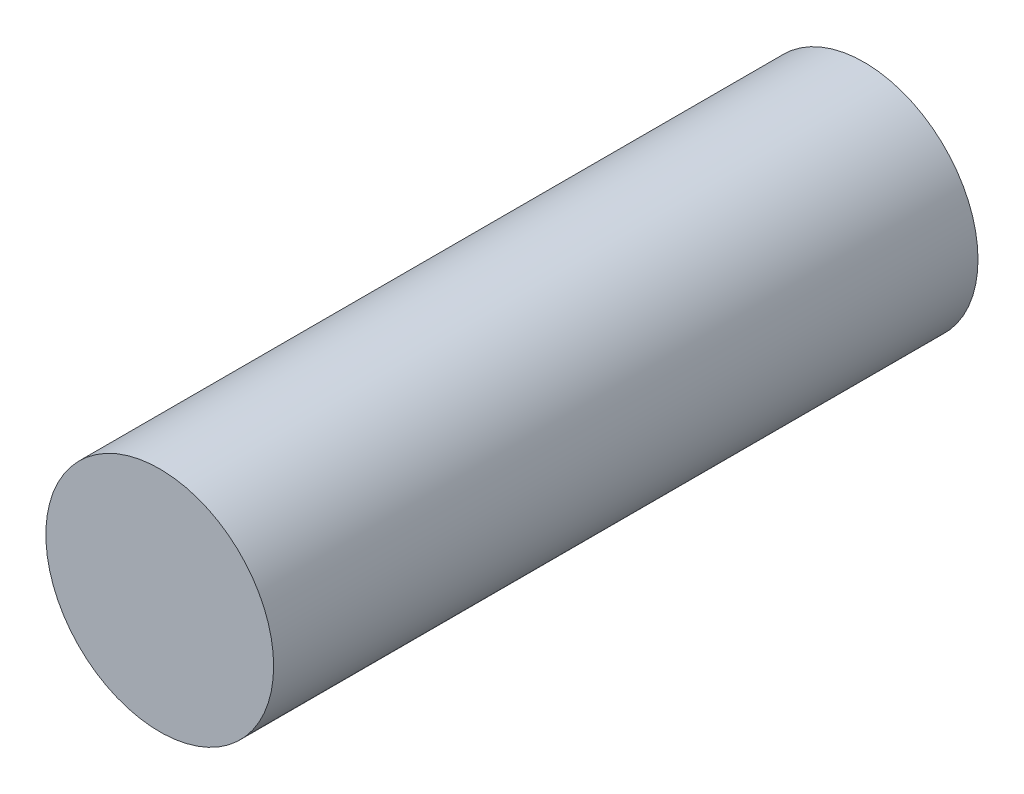
ISO-10303-21;
HEADER;
FILE_DESCRIPTION(('STEP AP214'),'2;1');
FILE_NAME('part.step','',(''),(''),'','','');
FILE_SCHEMA(('AUTOMOTIVE_DESIGN { 1 0 10303 214 1 1 1 1 }'));
ENDSEC;
DATA;
#1=APPLICATION_CONTEXT('core data for automotive mechanical design processes');
#2=APPLICATION_PROTOCOL_DEFINITION('international standard','automotive_design',2000,#1);
#3=PRODUCT_CONTEXT('',#1,'mechanical');
#4=PRODUCT('Part','Part','',(#3));
#5=PRODUCT_RELATED_PRODUCT_CATEGORY('part','',(#4));
#6=PRODUCT_DEFINITION_FORMATION('','',#4);
#7=PRODUCT_DEFINITION_CONTEXT('part definition',#1,'design');
#8=PRODUCT_DEFINITION('design','',#6,#7);
#9=PRODUCT_DEFINITION_SHAPE('','',#8);
#10=(LENGTH_UNIT() NAMED_UNIT(*) SI_UNIT(.MILLI.,.METRE.));
#11=(NAMED_UNIT(*) PLANE_ANGLE_UNIT() SI_UNIT($,.RADIAN.));
#12=(NAMED_UNIT(*) SI_UNIT($,.STERADIAN.) SOLID_ANGLE_UNIT());
#13=UNCERTAINTY_MEASURE_WITH_UNIT(LENGTH_MEASURE(1.E-05),#10,'distance_accuracy_value','');
#14=(GEOMETRIC_REPRESENTATION_CONTEXT(3) GLOBAL_UNCERTAINTY_ASSIGNED_CONTEXT((#13)) GLOBAL_UNIT_ASSIGNED_CONTEXT((#10,
#11,#12)) REPRESENTATION_CONTEXT('',''));
#15=CARTESIAN_POINT('',(0.,0.,0.));
#16=DIRECTION('',(0.,0.,1.));
#17=DIRECTION('',(1.,0.,0.));
#18=AXIS2_PLACEMENT_3D('',#15,#16,#17);
#19=CARTESIAN_POINT('',(0.,0.,23.5));
#20=DIRECTION('',(0.,0.,-1.));
#21=DIRECTION('',(-1.,0.,0.));
#22=AXIS2_PLACEMENT_3D('',#19,#20,#21);
#23=CYLINDRICAL_SURFACE('',#22,3.8);
#24=CARTESIAN_POINT('',(0.,0.,23.5));
#25=DIRECTION('',(0.,0.,1.));
#26=DIRECTION('',(1.,0.,0.));
#27=AXIS2_PLACEMENT_3D('',#24,#25,#26);
#28=CIRCLE('',#27,3.8);
#29=CARTESIAN_POINT('',(3.8,0.,23.5));
#30=VERTEX_POINT('',#29);
#31=EDGE_CURVE('E10',#30,#30,#28,.T.);
#32=ORIENTED_EDGE('',*,*,#31,.F.);
#33=EDGE_LOOP('',(#32));
#34=FACE_BOUND('',#33,.T.);
#35=CARTESIAN_POINT('',(0.,0.,0.));
#36=DIRECTION('',(0.,0.,1.));
#37=DIRECTION('',(1.,0.,0.));
#38=AXIS2_PLACEMENT_3D('',#35,#36,#37);
#39=CIRCLE('',#38,3.8);
#40=CARTESIAN_POINT('',(3.8,0.,0.));
#41=VERTEX_POINT('',#40);
#42=EDGE_CURVE('E40',#41,#41,#39,.T.);
#43=ORIENTED_EDGE('',*,*,#42,.T.);
#44=EDGE_LOOP('',(#43));
#45=FACE_BOUND('',#44,.T.);
#46=ADVANCED_FACE('F37',(#34,#45),#23,.T.);
#47=CARTESIAN_POINT('',(0.,0.,23.5));
#48=DIRECTION('',(0.,0.,1.));
#49=DIRECTION('',(1.,0.,0.));
#50=AXIS2_PLACEMENT_3D('',#47,#48,#49);
#51=PLANE('',#50);
#52=ORIENTED_EDGE('',*,*,#31,.T.);
#53=EDGE_LOOP('',(#52));
#54=FACE_BOUND('',#53,.T.);
#55=ADVANCED_FACE('F52',(#54),#51,.T.);
#56=CARTESIAN_POINT('',(0.,0.,0.));
#57=DIRECTION('',(0.,0.,1.));
#58=DIRECTION('',(1.,0.,0.));
#59=AXIS2_PLACEMENT_3D('',#56,#57,#58);
#60=PLANE('',#59);
#61=ORIENTED_EDGE('',*,*,#42,.F.);
#62=EDGE_LOOP('',(#61));
#63=FACE_BOUND('',#62,.T.);
#64=ADVANCED_FACE('F50',(#63),#60,.F.);
#65=CLOSED_SHELL('',(#46,#55,#64));
#66=MANIFOLD_SOLID_BREP('B2',#65);
#67=ADVANCED_BREP_SHAPE_REPRESENTATION('',(#18,#66),#14);
#68=SHAPE_DEFINITION_REPRESENTATION(#9,#67);
ENDSEC;
END-ISO-10303-21;
